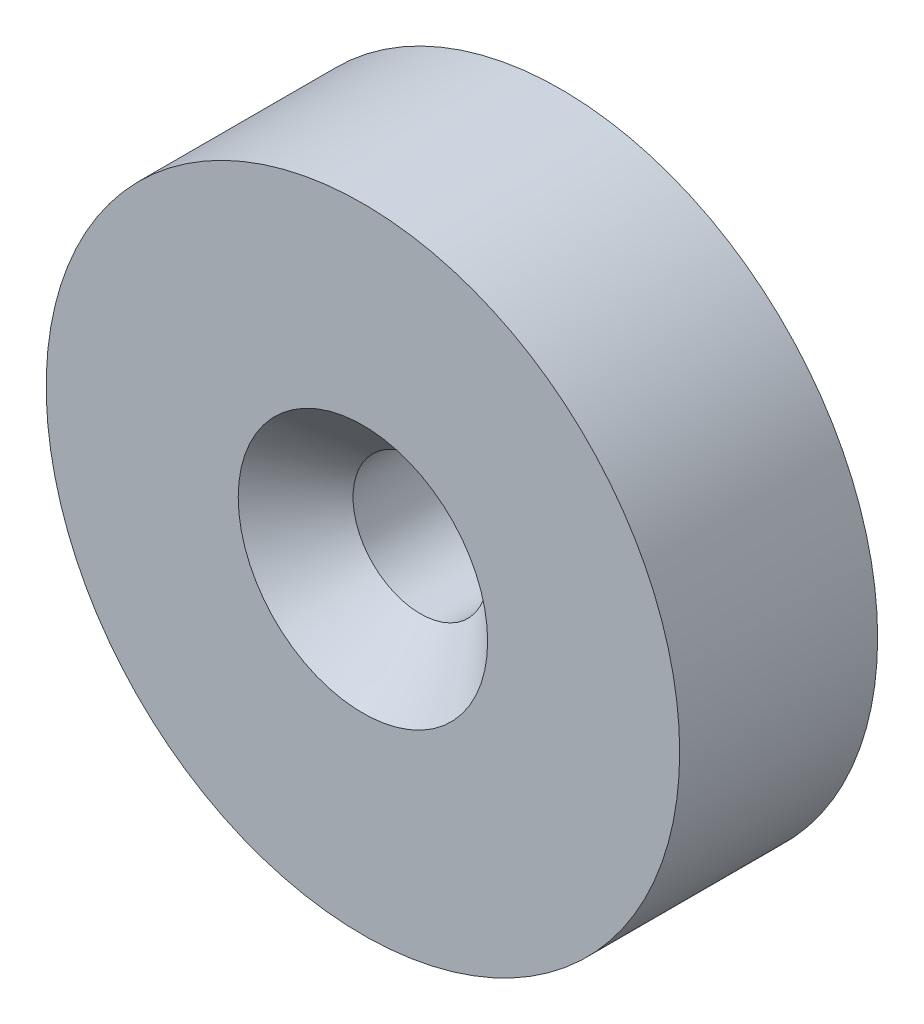
ISO-10303-21;
HEADER;
FILE_DESCRIPTION(('STEP AP214'),'2;1');
FILE_NAME('part.step','',(''),(''),'','','');
FILE_SCHEMA(('AUTOMOTIVE_DESIGN { 1 0 10303 214 1 1 1 1 }'));
ENDSEC;
DATA;
#1=APPLICATION_CONTEXT('core data for automotive mechanical design processes');
#2=APPLICATION_PROTOCOL_DEFINITION('international standard','automotive_design',2000,#1);
#3=PRODUCT_CONTEXT('',#1,'mechanical');
#4=PRODUCT('Part','Part','',(#3));
#5=PRODUCT_RELATED_PRODUCT_CATEGORY('part','',(#4));
#6=PRODUCT_DEFINITION_FORMATION('','',#4);
#7=PRODUCT_DEFINITION_CONTEXT('part definition',#1,'design');
#8=PRODUCT_DEFINITION('design','',#6,#7);
#9=PRODUCT_DEFINITION_SHAPE('','',#8);
#10=(LENGTH_UNIT() NAMED_UNIT(*) SI_UNIT(.MILLI.,.METRE.));
#11=(NAMED_UNIT(*) PLANE_ANGLE_UNIT() SI_UNIT($,.RADIAN.));
#12=(NAMED_UNIT(*) SI_UNIT($,.STERADIAN.) SOLID_ANGLE_UNIT());
#13=UNCERTAINTY_MEASURE_WITH_UNIT(LENGTH_MEASURE(1.E-05),#10,'distance_accuracy_value','');
#14=(GEOMETRIC_REPRESENTATION_CONTEXT(3) GLOBAL_UNCERTAINTY_ASSIGNED_CONTEXT((#13)) GLOBAL_UNIT_ASSIGNED_CONTEXT((#10,
#11,#12)) REPRESENTATION_CONTEXT('',''));
#15=CARTESIAN_POINT('',(0.,0.,0.));
#16=DIRECTION('',(0.,0.,1.));
#17=DIRECTION('',(1.,0.,0.));
#18=AXIS2_PLACEMENT_3D('',#15,#16,#17);
#19=CARTESIAN_POINT('',(0.,0.,5.));
#20=DIRECTION('',(0.,0.,-1.));
#21=DIRECTION('',(-1.,0.,0.));
#22=AXIS2_PLACEMENT_3D('',#19,#20,#21);
#23=CYLINDRICAL_SURFACE('',#22,8.);
#24=CARTESIAN_POINT('',(0.,0.,5.));
#25=DIRECTION('',(0.,0.,1.));
#26=DIRECTION('',(1.,0.,0.));
#27=AXIS2_PLACEMENT_3D('',#24,#25,#26);
#28=CIRCLE('',#27,8.);
#29=CARTESIAN_POINT('',(8.,0.,5.));
#30=VERTEX_POINT('',#29);
#31=EDGE_CURVE('E10',#30,#30,#28,.T.);
#32=ORIENTED_EDGE('',*,*,#31,.F.);
#33=EDGE_LOOP('',(#32));
#34=FACE_BOUND('',#33,.T.);
#35=CARTESIAN_POINT('',(0.,0.,0.));
#36=DIRECTION('',(0.,0.,1.));
#37=DIRECTION('',(1.,0.,0.));
#38=AXIS2_PLACEMENT_3D('',#35,#36,#37);
#39=CIRCLE('',#38,8.);
#40=CARTESIAN_POINT('',(8.,0.,0.));
#41=VERTEX_POINT('',#40);
#42=EDGE_CURVE('E41',#41,#41,#39,.T.);
#43=ORIENTED_EDGE('',*,*,#42,.T.);
#44=EDGE_LOOP('',(#43));
#45=FACE_BOUND('',#44,.T.);
#46=ADVANCED_FACE('F38',(#34,#45),#23,.T.);
#47=CARTESIAN_POINT('',(0.,0.,5.));
#48=DIRECTION('',(0.,0.,1.));
#49=DIRECTION('',(1.,0.,0.));
#50=AXIS2_PLACEMENT_3D('',#47,#48,#49);
#51=PLANE('',#50);
#52=CARTESIAN_POINT('',(0.,0.,5.));
#53=DIRECTION('',(0.,0.,1.));
#54=DIRECTION('',(1.,0.,0.));
#55=AXIS2_PLACEMENT_3D('',#52,#53,#54);
#56=CIRCLE('',#55,3.15);
#57=CARTESIAN_POINT('',(3.15,0.,5.));
#58=VERTEX_POINT('',#57);
#59=EDGE_CURVE('E55',#58,#58,#56,.T.);
#60=ORIENTED_EDGE('',*,*,#59,.F.);
#61=EDGE_LOOP('',(#60));
#62=FACE_BOUND('',#61,.T.);
#63=ORIENTED_EDGE('',*,*,#31,.T.);
#64=EDGE_LOOP('',(#63));
#65=FACE_BOUND('',#64,.T.);
#66=ADVANCED_FACE('F61',(#62,#65),#51,.T.);
#67=CARTESIAN_POINT('',(0.,0.,0.));
#68=DIRECTION('',(0.,0.,1.));
#69=DIRECTION('',(1.,0.,0.));
#70=AXIS2_PLACEMENT_3D('',#67,#68,#69);
#71=PLANE('',#70);
#72=CARTESIAN_POINT('',(0.,0.,0.));
#73=DIRECTION('',(0.,0.,1.));
#74=DIRECTION('',(1.,0.,0.));
#75=AXIS2_PLACEMENT_3D('',#72,#73,#74);
#76=CIRCLE('',#75,1.7);
#77=CARTESIAN_POINT('',(1.7,0.,0.));
#78=VERTEX_POINT('',#77);
#79=EDGE_CURVE('E48',#78,#78,#76,.T.);
#80=ORIENTED_EDGE('',*,*,#79,.T.);
#81=EDGE_LOOP('',(#80));
#82=FACE_BOUND('',#81,.T.);
#83=ORIENTED_EDGE('',*,*,#42,.F.);
#84=EDGE_LOOP('',(#83));
#85=FACE_BOUND('',#84,.T.);
#86=ADVANCED_FACE('F63',(#82,#85),#71,.F.);
#87=CARTESIAN_POINT('',(0.,0.,5.));
#88=DIRECTION('',(0.,0.,1.));
#89=DIRECTION('',(1.,0.,0.));
#90=AXIS2_PLACEMENT_3D('',#87,#88,#89);
#91=CYLINDRICAL_SURFACE('',#90,1.7);
#92=ORIENTED_EDGE('',*,*,#79,.F.);
#93=EDGE_LOOP('',(#92));
#94=FACE_BOUND('',#93,.T.);
#95=CARTESIAN_POINT('',(0.,0.,3.55));
#96=DIRECTION('',(0.,0.,1.));
#97=DIRECTION('',(1.,0.,0.));
#98=AXIS2_PLACEMENT_3D('',#95,#96,#97);
#99=CIRCLE('',#98,1.7);
#100=CARTESIAN_POINT('',(1.7,0.,3.55));
#101=VERTEX_POINT('',#100);
#102=EDGE_CURVE('E52',#101,#101,#99,.T.);
#103=ORIENTED_EDGE('',*,*,#102,.T.);
#104=EDGE_LOOP('',(#103));
#105=FACE_BOUND('',#104,.T.);
#106=ADVANCED_FACE('F69',(#94,#105),#91,.F.);
#107=CARTESIAN_POINT('',(0.,0.,5.));
#108=DIRECTION('',(0.,0.,1.));
#109=DIRECTION('',(1.,0.,0.));
#110=AXIS2_PLACEMENT_3D('',#107,#108,#109);
#111=CONICAL_SURFACE('',#110,3.15,0.785398163397449);
#112=ORIENTED_EDGE('',*,*,#102,.F.);
#113=EDGE_LOOP('',(#112));
#114=FACE_BOUND('',#113,.T.);
#115=ORIENTED_EDGE('',*,*,#59,.T.);
#116=EDGE_LOOP('',(#115));
#117=FACE_BOUND('',#116,.T.);
#118=ADVANCED_FACE('F59',(#114,#117),#111,.F.);
#119=CLOSED_SHELL('',(#46,#66,#86,#106,#118));
#120=MANIFOLD_SOLID_BREP('B2',#119);
#121=ADVANCED_BREP_SHAPE_REPRESENTATION('',(#18,#120),#14);
#122=SHAPE_DEFINITION_REPRESENTATION(#9,#121);
ENDSEC;
END-ISO-10303-21;
